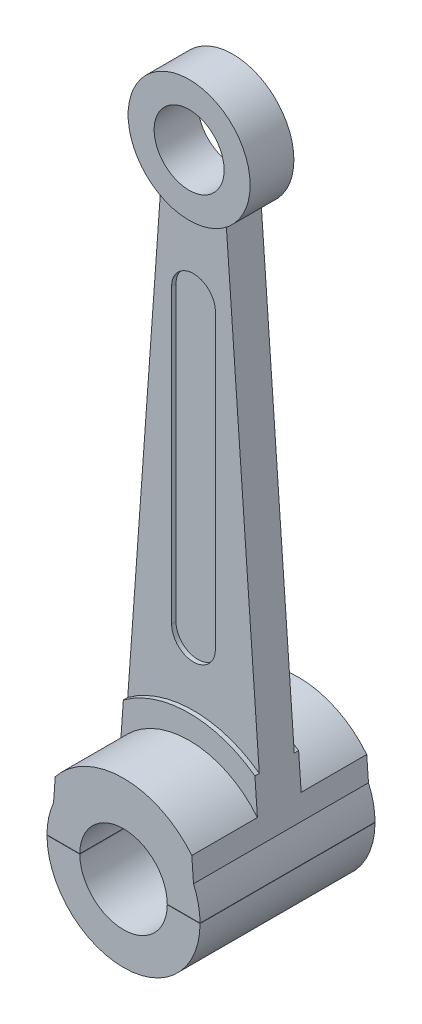
ISO-10303-21;
HEADER;
FILE_DESCRIPTION(('STEP AP214'),'2;1');
FILE_NAME('part.step','',(''),(''),'','','');
FILE_SCHEMA(('AUTOMOTIVE_DESIGN { 1 0 10303 214 1 1 1 1 }'));
ENDSEC;
DATA;
#1=APPLICATION_CONTEXT('core data for automotive mechanical design processes');
#2=APPLICATION_PROTOCOL_DEFINITION('international standard','automotive_design',2000,#1);
#3=PRODUCT_CONTEXT('',#1,'mechanical');
#4=PRODUCT('Part','Part','',(#3));
#5=PRODUCT_RELATED_PRODUCT_CATEGORY('part','',(#4));
#6=PRODUCT_DEFINITION_FORMATION('','',#4);
#7=PRODUCT_DEFINITION_CONTEXT('part definition',#1,'design');
#8=PRODUCT_DEFINITION('design','',#6,#7);
#9=PRODUCT_DEFINITION_SHAPE('','',#8);
#10=(LENGTH_UNIT() NAMED_UNIT(*) SI_UNIT(.MILLI.,.METRE.));
#11=(NAMED_UNIT(*) PLANE_ANGLE_UNIT() SI_UNIT($,.RADIAN.));
#12=(NAMED_UNIT(*) SI_UNIT($,.STERADIAN.) SOLID_ANGLE_UNIT());
#13=UNCERTAINTY_MEASURE_WITH_UNIT(LENGTH_MEASURE(1.E-05),#10,'distance_accuracy_value','');
#14=(GEOMETRIC_REPRESENTATION_CONTEXT(3) GLOBAL_UNCERTAINTY_ASSIGNED_CONTEXT((#13)) GLOBAL_UNIT_ASSIGNED_CONTEXT((#10,
#11,#12)) REPRESENTATION_CONTEXT('',''));
#15=CARTESIAN_POINT('',(0.,0.,0.));
#16=DIRECTION('',(0.,0.,1.));
#17=DIRECTION('',(1.,0.,0.));
#18=AXIS2_PLACEMENT_3D('',#15,#16,#17);
#19=CARTESIAN_POINT('',(0.,0.,-50.8));
#20=DIRECTION('',(0.,0.,1.));
#21=DIRECTION('',(1.,0.,0.));
#22=AXIS2_PLACEMENT_3D('',#19,#20,#21);
#23=PLANE('',#22);
#24=CARTESIAN_POINT('',(0.,0.,-50.8));
#25=DIRECTION('',(0.,0.,1.));
#26=DIRECTION('',(1.,0.,0.));
#27=AXIS2_PLACEMENT_3D('',#24,#25,#26);
#28=CIRCLE('',#27,44.45);
#29=CARTESIAN_POINT('',(40.64,18.0053575360224,-50.8));
#30=VERTEX_POINT('',#29);
#31=CARTESIAN_POINT('',(44.4498838855626,0.101599999999998,-50.8));
#32=VERTEX_POINT('',#31);
#33=EDGE_CURVE('E58',#30,#32,#28,.F.);
#34=ORIENTED_EDGE('',*,*,#33,.T.);
#35=DIRECTION('',(-1.,0.,0.));
#36=VECTOR('',#35,1.);
#37=CARTESIAN_POINT('',(0.,0.10159999999999,-50.8));
#38=LINE('',#37,#36);
#39=CARTESIAN_POINT('',(25.3997967991872,0.101599999999994,-50.8));
#40=VERTEX_POINT('',#39);
#41=EDGE_CURVE('E328',#32,#40,#38,.T.);
#42=ORIENTED_EDGE('',*,*,#41,.T.);
#43=CARTESIAN_POINT('',(0.,0.,-50.8));
#44=DIRECTION('',(0.,0.,1.));
#45=DIRECTION('',(1.,0.,0.));
#46=AXIS2_PLACEMENT_3D('',#43,#44,#45);
#47=CIRCLE('',#46,25.4);
#48=CARTESIAN_POINT('',(-25.3997967991872,0.101599999999985,-50.8));
#49=VERTEX_POINT('',#48);
#50=EDGE_CURVE('E332',#40,#49,#47,.T.);
#51=ORIENTED_EDGE('',*,*,#50,.T.);
#52=CARTESIAN_POINT('',(-44.4498838855626,0.101599999999982,-50.8));
#53=VERTEX_POINT('',#52);
#54=EDGE_CURVE('E75',#49,#53,#38,.T.);
#55=ORIENTED_EDGE('',*,*,#54,.T.);
#56=CARTESIAN_POINT('',(-40.64,18.0053575360224,-50.8));
#57=VERTEX_POINT('',#56);
#58=EDGE_CURVE('E307',#53,#57,#28,.F.);
#59=ORIENTED_EDGE('',*,*,#58,.T.);
#60=DIRECTION('',(0.0718181006562887,0.997417746191697,0.));
#61=VECTOR('',#60,1.);
#62=CARTESIAN_POINT('',(-41.7201568395476,3.00401956425881,-50.8));
#63=LINE('',#62,#61);
#64=CARTESIAN_POINT('',(-39.6497960989701,31.7574191223106,-50.8));
#65=VERTEX_POINT('',#64);
#66=EDGE_CURVE('E281',#57,#65,#63,.T.);
#67=ORIENTED_EDGE('',*,*,#66,.T.);
#68=CARTESIAN_POINT('',(0.,0.,-50.8));
#69=DIRECTION('',(0.,0.,1.));
#70=DIRECTION('',(1.,0.,0.));
#71=AXIS2_PLACEMENT_3D('',#68,#69,#70);
#72=CIRCLE('',#71,50.8);
#73=CARTESIAN_POINT('',(39.6497960989701,31.7574191223106,-50.8));
#74=VERTEX_POINT('',#73);
#75=EDGE_CURVE('E237',#74,#65,#72,.T.);
#76=ORIENTED_EDGE('',*,*,#75,.F.);
#77=DIRECTION('',(0.0718181006562886,-0.997417746191697,0.));
#78=VECTOR('',#77,1.);
#79=CARTESIAN_POINT('',(41.7201568395476,3.0040195642588,-50.8));
#80=LINE('',#79,#78);
#81=EDGE_CURVE('E277',#74,#30,#80,.T.);
#82=ORIENTED_EDGE('',*,*,#81,.T.);
#83=EDGE_LOOP('',(#34,#42,#51,#55,#59,#67,#76,#82));
#84=FACE_BOUND('',#83,.T.);
#85=ADVANCED_FACE('F55',(#84),#23,.F.);
#86=CARTESIAN_POINT('',(0.,0.,12.7));
#87=DIRECTION('',(0.,0.,-1.));
#88=DIRECTION('',(-1.,0.,0.));
#89=AXIS2_PLACEMENT_3D('',#86,#87,#88);
#90=CYLINDRICAL_SURFACE('',#89,25.4);
#91=DIRECTION('',(0.,0.,-1.));
#92=VECTOR('',#91,1.);
#93=CARTESIAN_POINT('',(25.3997967991872,0.101599999999994,12.7));
#94=LINE('',#93,#92);
#95=CARTESIAN_POINT('',(25.3997967991872,0.101599999999994,50.8));
#96=VERTEX_POINT('',#95);
#97=EDGE_CURVE('E327',#96,#40,#94,.T.);
#98=ORIENTED_EDGE('',*,*,#97,.F.);
#99=CARTESIAN_POINT('',(0.,0.,50.8));
#100=DIRECTION('',(0.,0.,1.));
#101=DIRECTION('',(1.,0.,0.));
#102=AXIS2_PLACEMENT_3D('',#99,#100,#101);
#103=CIRCLE('',#102,25.4);
#104=CARTESIAN_POINT('',(-25.3997967991872,0.101599999999985,50.8));
#105=VERTEX_POINT('',#104);
#106=EDGE_CURVE('E261',#96,#105,#103,.T.);
#107=ORIENTED_EDGE('',*,*,#106,.T.);
#108=DIRECTION('',(0.,0.,-1.));
#109=VECTOR('',#108,1.);
#110=CARTESIAN_POINT('',(-25.3997967991872,0.101599999999985,12.7));
#111=LINE('',#110,#109);
#112=EDGE_CURVE('E65',#49,#105,#111,.F.);
#113=ORIENTED_EDGE('',*,*,#112,.F.);
#114=ORIENTED_EDGE('',*,*,#50,.F.);
#115=EDGE_LOOP('',(#98,#107,#113,#114));
#116=FACE_BOUND('',#115,.T.);
#117=ADVANCED_FACE('F345',(#116),#90,.F.);
#118=CARTESIAN_POINT('',(0.,0.,50.8));
#119=DIRECTION('',(0.,0.,1.));
#120=DIRECTION('',(1.,0.,0.));
#121=AXIS2_PLACEMENT_3D('',#118,#119,#120);
#122=PLANE('',#121);
#123=DIRECTION('',(-1.,0.,0.));
#124=VECTOR('',#123,1.);
#125=CARTESIAN_POINT('',(0.,0.10159999999999,50.8));
#126=LINE('',#125,#124);
#127=CARTESIAN_POINT('',(44.4498838855626,0.101599999999998,50.8));
#128=VERTEX_POINT('',#127);
#129=EDGE_CURVE('E67',#128,#96,#126,.T.);
#130=ORIENTED_EDGE('',*,*,#129,.F.);
#131=CARTESIAN_POINT('',(0.,0.,50.8));
#132=DIRECTION('',(0.,0.,1.));
#133=DIRECTION('',(1.,0.,0.));
#134=AXIS2_PLACEMENT_3D('',#131,#132,#133);
#135=CIRCLE('',#134,44.45);
#136=CARTESIAN_POINT('',(40.64,18.0053575360224,50.8));
#137=VERTEX_POINT('',#136);
#138=EDGE_CURVE('E260',#137,#128,#135,.F.);
#139=ORIENTED_EDGE('',*,*,#138,.F.);
#140=DIRECTION('',(0.0718181006562886,-0.997417746191697,0.));
#141=VECTOR('',#140,1.);
#142=CARTESIAN_POINT('',(41.7201568395476,3.0040195642588,50.8));
#143=LINE('',#142,#141);
#144=CARTESIAN_POINT('',(39.6497960989701,31.7574191223106,50.8));
#145=VERTEX_POINT('',#144);
#146=EDGE_CURVE('E276',#145,#137,#143,.T.);
#147=ORIENTED_EDGE('',*,*,#146,.F.);
#148=CARTESIAN_POINT('',(0.,0.,50.8));
#149=DIRECTION('',(0.,0.,1.));
#150=DIRECTION('',(1.,0.,0.));
#151=AXIS2_PLACEMENT_3D('',#148,#149,#150);
#152=CIRCLE('',#151,50.8);
#153=CARTESIAN_POINT('',(-39.6497960989701,31.7574191223106,50.8));
#154=VERTEX_POINT('',#153);
#155=EDGE_CURVE('E256',#145,#154,#152,.T.);
#156=ORIENTED_EDGE('',*,*,#155,.T.);
#157=DIRECTION('',(0.0718181006562887,0.997417746191697,0.));
#158=VECTOR('',#157,1.);
#159=CARTESIAN_POINT('',(-41.7201568395476,3.00401956425881,50.8));
#160=LINE('',#159,#158);
#161=CARTESIAN_POINT('',(-40.64,18.0053575360224,50.8));
#162=VERTEX_POINT('',#161);
#163=EDGE_CURVE('E316',#162,#154,#160,.T.);
#164=ORIENTED_EDGE('',*,*,#163,.F.);
#165=CARTESIAN_POINT('',(-44.4498838855626,0.101599999999982,50.8));
#166=VERTEX_POINT('',#165);
#167=EDGE_CURVE('E289',#166,#162,#135,.F.);
#168=ORIENTED_EDGE('',*,*,#167,.F.);
#169=EDGE_CURVE('E12',#105,#166,#126,.T.);
#170=ORIENTED_EDGE('',*,*,#169,.F.);
#171=ORIENTED_EDGE('',*,*,#106,.F.);
#172=EDGE_LOOP('',(#130,#139,#147,#156,#164,#168,#170,#171));
#173=FACE_BOUND('',#172,.T.);
#174=ADVANCED_FACE('F349',(#173),#122,.T.);
#175=CARTESIAN_POINT('',(0.,0.,-81.2799999999999));
#176=DIRECTION('',(0.,0.,1.));
#177=DIRECTION('',(1.,0.,0.));
#178=AXIS2_PLACEMENT_3D('',#175,#176,#177);
#179=CYLINDRICAL_SURFACE('',#178,44.45);
#180=ORIENTED_EDGE('',*,*,#138,.T.);
#181=DIRECTION('',(0.,0.,1.));
#182=VECTOR('',#181,1.);
#183=CARTESIAN_POINT('',(44.4498838855626,0.101599999999998,-81.2799999999999));
#184=LINE('',#183,#182);
#185=EDGE_CURVE('E97',#128,#32,#184,.F.);
#186=ORIENTED_EDGE('',*,*,#185,.T.);
#187=ORIENTED_EDGE('',*,*,#33,.F.);
#188=DIRECTION('',(0.,0.,1.));
#189=VECTOR('',#188,1.);
#190=CARTESIAN_POINT('',(40.64,18.0053575360224,-81.2799999999999));
#191=LINE('',#190,#189);
#192=EDGE_CURVE('E320',#30,#137,#191,.T.);
#193=ORIENTED_EDGE('',*,*,#192,.T.);
#194=EDGE_LOOP('',(#180,#186,#187,#193));
#195=FACE_BOUND('',#194,.T.);
#196=ADVANCED_FACE('F518',(#195),#179,.T.);
#197=ORIENTED_EDGE('',*,*,#58,.F.);
#198=DIRECTION('',(0.,0.,1.));
#199=VECTOR('',#198,1.);
#200=CARTESIAN_POINT('',(-44.4498838855626,0.101599999999982,-81.2799999999999));
#201=LINE('',#200,#199);
#202=EDGE_CURVE('E324',#53,#166,#201,.T.);
#203=ORIENTED_EDGE('',*,*,#202,.T.);
#204=ORIENTED_EDGE('',*,*,#167,.T.);
#205=DIRECTION('',(0.,0.,1.));
#206=VECTOR('',#205,1.);
#207=CARTESIAN_POINT('',(-40.64,18.0053575360224,-81.2799999999999));
#208=LINE('',#207,#206);
#209=EDGE_CURVE('E304',#57,#162,#208,.T.);
#210=ORIENTED_EDGE('',*,*,#209,.F.);
#211=EDGE_LOOP('',(#197,#203,#204,#210));
#212=FACE_BOUND('',#211,.T.);
#213=ADVANCED_FACE('F359',(#212),#179,.T.);
#214=CARTESIAN_POINT('',(0.,0.,12.7));
#215=DIRECTION('',(0.,0.,-1.));
#216=DIRECTION('',(-1.,0.,0.));
#217=AXIS2_PLACEMENT_3D('',#214,#215,#216);
#218=CYLINDRICAL_SURFACE('',#217,64.516);
#219=CARTESIAN_POINT('',(0.,0.,12.7));
#220=DIRECTION('',(0.,0.,1.));
#221=DIRECTION('',(1.,0.,0.));
#222=AXIS2_PLACEMENT_3D('',#219,#220,#221);
#223=CIRCLE('',#222,64.516);
#224=CARTESIAN_POINT('',(38.1924925018651,51.9966130867673,12.7));
#225=VERTEX_POINT('',#224);
#226=CARTESIAN_POINT('',(-38.1924925018651,51.9966130867673,12.7));
#227=VERTEX_POINT('',#226);
#228=EDGE_CURVE('E207',#225,#227,#223,.T.);
#229=ORIENTED_EDGE('',*,*,#228,.F.);
#230=DIRECTION('',(0.,0.,-1.));
#231=VECTOR('',#230,1.);
#232=CARTESIAN_POINT('',(38.1924925018651,51.9966130867673,12.7));
#233=LINE('',#232,#231);
#234=CARTESIAN_POINT('',(38.1924925018651,51.9966130867673,10.16));
#235=VERTEX_POINT('',#234);
#236=EDGE_CURVE('E285',#225,#235,#233,.T.);
#237=ORIENTED_EDGE('',*,*,#236,.T.);
#238=CARTESIAN_POINT('',(0.,0.,10.16));
#239=DIRECTION('',(0.,0.,1.));
#240=DIRECTION('',(1.,0.,0.));
#241=AXIS2_PLACEMENT_3D('',#238,#239,#240);
#242=CIRCLE('',#241,64.516);
#243=CARTESIAN_POINT('',(-38.1924925018651,51.9966130867673,10.16));
#244=VERTEX_POINT('',#243);
#245=EDGE_CURVE('E177',#235,#244,#242,.T.);
#246=ORIENTED_EDGE('',*,*,#245,.T.);
#247=DIRECTION('',(0.,0.,-1.));
#248=VECTOR('',#247,1.);
#249=CARTESIAN_POINT('',(-38.1924925018651,51.9966130867673,12.7));
#250=LINE('',#249,#248);
#251=EDGE_CURVE('E139',#244,#227,#250,.F.);
#252=ORIENTED_EDGE('',*,*,#251,.T.);
#253=EDGE_LOOP('',(#229,#237,#246,#252));
#254=FACE_BOUND('',#253,.T.);
#255=ADVANCED_FACE('F532',(#254),#218,.T.);
#256=CARTESIAN_POINT('',(0.,101.6,10.16));
#257=DIRECTION('',(0.,0.,-1.));
#258=DIRECTION('',(-1.,0.,0.));
#259=AXIS2_PLACEMENT_3D('',#256,#257,#258);
#260=CYLINDRICAL_SURFACE('',#259,12.7);
#261=DIRECTION('',(0.,0.,-1.));
#262=VECTOR('',#261,1.);
#263=CARTESIAN_POINT('',(-12.7,101.6,10.16));
#264=LINE('',#263,#262);
#265=CARTESIAN_POINT('',(-12.7,101.6,-7.62));
#266=VERTEX_POINT('',#265);
#267=CARTESIAN_POINT('',(-12.7,101.6,-10.16));
#268=VERTEX_POINT('',#267);
#269=EDGE_CURVE('E217',#266,#268,#264,.T.);
#270=ORIENTED_EDGE('',*,*,#269,.F.);
#271=CARTESIAN_POINT('',(0.,101.6,-7.62));
#272=DIRECTION('',(0.,0.,1.));
#273=DIRECTION('',(1.,0.,0.));
#274=AXIS2_PLACEMENT_3D('',#271,#272,#273);
#275=CIRCLE('',#274,12.7);
#276=CARTESIAN_POINT('',(12.7,101.6,-7.62));
#277=VERTEX_POINT('',#276);
#278=EDGE_CURVE('E224',#266,#277,#275,.T.);
#279=ORIENTED_EDGE('',*,*,#278,.T.);
#280=DIRECTION('',(0.,0.,-1.));
#281=VECTOR('',#280,1.);
#282=CARTESIAN_POINT('',(12.7,101.6,10.16));
#283=LINE('',#282,#281);
#284=CARTESIAN_POINT('',(12.7,101.6,-10.16));
#285=VERTEX_POINT('',#284);
#286=EDGE_CURVE('E228',#277,#285,#283,.T.);
#287=ORIENTED_EDGE('',*,*,#286,.T.);
#288=CARTESIAN_POINT('',(0.,101.6,-10.16));
#289=DIRECTION('',(0.,0.,1.));
#290=DIRECTION('',(1.,0.,0.));
#291=AXIS2_PLACEMENT_3D('',#288,#289,#290);
#292=CIRCLE('',#291,12.7);
#293=EDGE_CURVE('E183',#268,#285,#292,.T.);
#294=ORIENTED_EDGE('',*,*,#293,.F.);
#295=EDGE_LOOP('',(#270,#279,#287,#294));
#296=FACE_BOUND('',#295,.T.);
#297=ADVANCED_FACE('F432',(#296),#260,.F.);
#298=CARTESIAN_POINT('',(-12.7,0.,10.16));
#299=DIRECTION('',(1.,0.,0.));
#300=DIRECTION('',(0.,1.,0.));
#301=AXIS2_PLACEMENT_3D('',#298,#299,#300);
#302=PLANE('',#301);
#303=DIRECTION('',(0.,0.,-1.));
#304=VECTOR('',#303,1.);
#305=CARTESIAN_POINT('',(-12.7,271.526,10.16));
#306=LINE('',#305,#304);
#307=CARTESIAN_POINT('',(-12.7,271.526,-7.62));
#308=VERTEX_POINT('',#307);
#309=CARTESIAN_POINT('',(-12.7,271.526,-10.16));
#310=VERTEX_POINT('',#309);
#311=EDGE_CURVE('E216',#308,#310,#306,.T.);
#312=ORIENTED_EDGE('',*,*,#311,.F.);
#313=DIRECTION('',(0.,-1.,0.));
#314=VECTOR('',#313,1.);
#315=CARTESIAN_POINT('',(-12.7,0.,-7.62));
#316=LINE('',#315,#314);
#317=EDGE_CURVE('E229',#308,#266,#316,.T.);
#318=ORIENTED_EDGE('',*,*,#317,.T.);
#319=ORIENTED_EDGE('',*,*,#269,.T.);
#320=DIRECTION('',(0.,-1.,0.));
#321=VECTOR('',#320,1.);
#322=CARTESIAN_POINT('',(-12.7,0.,-10.16));
#323=LINE('',#322,#321);
#324=EDGE_CURVE('E405',#310,#268,#323,.T.);
#325=ORIENTED_EDGE('',*,*,#324,.F.);
#326=EDGE_LOOP('',(#312,#318,#319,#325));
#327=FACE_BOUND('',#326,.T.);
#328=ADVANCED_FACE('F553',(#327),#302,.T.);
#329=CARTESIAN_POINT('',(0.,271.526,10.16));
#330=DIRECTION('',(0.,0.,-1.));
#331=DIRECTION('',(-1.,0.,0.));
#332=AXIS2_PLACEMENT_3D('',#329,#330,#331);
#333=CYLINDRICAL_SURFACE('',#332,12.7);
#334=DIRECTION('',(0.,0.,-1.));
#335=VECTOR('',#334,1.);
#336=CARTESIAN_POINT('',(12.7,271.526,10.16));
#337=LINE('',#336,#335);
#338=CARTESIAN_POINT('',(12.7,271.526,-7.62));
#339=VERTEX_POINT('',#338);
#340=CARTESIAN_POINT('',(12.7,271.526,-10.16));
#341=VERTEX_POINT('',#340);
#342=EDGE_CURVE('E396',#339,#341,#337,.T.);
#343=ORIENTED_EDGE('',*,*,#342,.F.);
#344=CARTESIAN_POINT('',(0.,271.526,-7.62));
#345=DIRECTION('',(0.,0.,1.));
#346=DIRECTION('',(1.,0.,0.));
#347=AXIS2_PLACEMENT_3D('',#344,#345,#346);
#348=CIRCLE('',#347,12.7);
#349=EDGE_CURVE('E212',#339,#308,#348,.T.);
#350=ORIENTED_EDGE('',*,*,#349,.T.);
#351=ORIENTED_EDGE('',*,*,#311,.T.);
#352=CARTESIAN_POINT('',(0.,271.526,-10.16));
#353=DIRECTION('',(0.,0.,1.));
#354=DIRECTION('',(1.,0.,0.));
#355=AXIS2_PLACEMENT_3D('',#352,#353,#354);
#356=CIRCLE('',#355,12.7);
#357=EDGE_CURVE('E409',#341,#310,#356,.T.);
#358=ORIENTED_EDGE('',*,*,#357,.F.);
#359=EDGE_LOOP('',(#343,#350,#351,#358));
#360=FACE_BOUND('',#359,.T.);
#361=ADVANCED_FACE('F547',(#360),#333,.F.);
#362=CARTESIAN_POINT('',(12.7,0.,10.16));
#363=DIRECTION('',(1.,0.,0.));
#364=DIRECTION('',(0.,1.,0.));
#365=AXIS2_PLACEMENT_3D('',#362,#363,#364);
#366=PLANE('',#365);
#367=DIRECTION('',(0.,-1.,0.));
#368=VECTOR('',#367,1.);
#369=CARTESIAN_POINT('',(12.7,0.,-7.62));
#370=LINE('',#369,#368);
#371=EDGE_CURVE('E218',#339,#277,#370,.T.);
#372=ORIENTED_EDGE('',*,*,#371,.F.);
#373=ORIENTED_EDGE('',*,*,#342,.T.);
#374=DIRECTION('',(0.,-1.,0.));
#375=VECTOR('',#374,1.);
#376=CARTESIAN_POINT('',(12.7,0.,-10.16));
#377=LINE('',#376,#375);
#378=EDGE_CURVE('E173',#341,#285,#377,.T.);
#379=ORIENTED_EDGE('',*,*,#378,.T.);
#380=ORIENTED_EDGE('',*,*,#286,.F.);
#381=EDGE_LOOP('',(#372,#373,#379,#380));
#382=FACE_BOUND('',#381,.T.);
#383=ADVANCED_FACE('F543',(#382),#366,.F.);
#384=CARTESIAN_POINT('',(0.,347.726,12.7));
#385=DIRECTION('',(0.,0.,-1.));
#386=DIRECTION('',(-1.,0.,0.));
#387=AXIS2_PLACEMENT_3D('',#384,#385,#386);
#388=CYLINDRICAL_SURFACE('',#387,20.32);
#389=CARTESIAN_POINT('',(0.,347.726,12.7));
#390=DIRECTION('',(0.,0.,1.));
#391=DIRECTION('',(1.,0.,0.));
#392=AXIS2_PLACEMENT_3D('',#389,#390,#391);
#393=CIRCLE('',#392,20.32);
#394=CARTESIAN_POINT('',(20.32,347.726,12.7));
#395=VERTEX_POINT('',#394);
#396=EDGE_CURVE('E166',#395,#395,#393,.T.);
#397=ORIENTED_EDGE('',*,*,#396,.T.);
#398=EDGE_LOOP('',(#397));
#399=FACE_BOUND('',#398,.T.);
#400=CARTESIAN_POINT('',(0.,347.726,-12.7));
#401=DIRECTION('',(0.,0.,1.));
#402=DIRECTION('',(1.,0.,0.));
#403=AXIS2_PLACEMENT_3D('',#400,#401,#402);
#404=CIRCLE('',#403,20.32);
#405=CARTESIAN_POINT('',(20.32,347.726,-12.7));
#406=VERTEX_POINT('',#405);
#407=EDGE_CURVE('E200',#406,#406,#404,.T.);
#408=ORIENTED_EDGE('',*,*,#407,.F.);
#409=EDGE_LOOP('',(#408));
#410=FACE_BOUND('',#409,.T.);
#411=ADVANCED_FACE('F635',(#399,#410),#388,.F.);
#412=CARTESIAN_POINT('',(0.,347.726,12.7));
#413=DIRECTION('',(0.,0.,-1.));
#414=DIRECTION('',(-1.,0.,0.));
#415=AXIS2_PLACEMENT_3D('',#412,#413,#414);
#416=CYLINDRICAL_SURFACE('',#415,35.433);
#417=CARTESIAN_POINT('',(0.,347.726,10.16));
#418=DIRECTION('',(0.,0.,1.));
#419=DIRECTION('',(1.,0.,0.));
#420=AXIS2_PLACEMENT_3D('',#417,#418,#419);
#421=CIRCLE('',#420,35.433);
#422=CARTESIAN_POINT('',(-19.05,317.849671761744,10.16));
#423=VERTEX_POINT('',#422);
#424=CARTESIAN_POINT('',(19.05,317.849671761744,10.16));
#425=VERTEX_POINT('',#424);
#426=EDGE_CURVE('E154',#423,#425,#421,.T.);
#427=ORIENTED_EDGE('',*,*,#426,.T.);
#428=DIRECTION('',(0.,0.,-1.));
#429=VECTOR('',#428,1.);
#430=CARTESIAN_POINT('',(19.05,317.849671761744,10.16));
#431=LINE('',#430,#429);
#432=CARTESIAN_POINT('',(19.05,317.849671761744,-10.16));
#433=VERTEX_POINT('',#432);
#434=EDGE_CURVE('E165',#425,#433,#431,.T.);
#435=ORIENTED_EDGE('',*,*,#434,.T.);
#436=CARTESIAN_POINT('',(0.,347.726,-10.16));
#437=DIRECTION('',(0.,0.,1.));
#438=DIRECTION('',(1.,0.,0.));
#439=AXIS2_PLACEMENT_3D('',#436,#437,#438);
#440=CIRCLE('',#439,35.433);
#441=CARTESIAN_POINT('',(-19.05,317.849671761744,-10.16));
#442=VERTEX_POINT('',#441);
#443=EDGE_CURVE('E156',#442,#433,#440,.T.);
#444=ORIENTED_EDGE('',*,*,#443,.F.);
#445=DIRECTION('',(0.,0.,-1.));
#446=VECTOR('',#445,1.);
#447=CARTESIAN_POINT('',(-19.05,317.849671761744,10.16));
#448=LINE('',#447,#446);
#449=EDGE_CURVE('E137',#423,#442,#448,.T.);
#450=ORIENTED_EDGE('',*,*,#449,.F.);
#451=EDGE_LOOP('',(#427,#435,#444,#450));
#452=FACE_BOUND('',#451,.T.);
#453=CARTESIAN_POINT('',(0.,347.726,-12.7));
#454=DIRECTION('',(0.,0.,1.));
#455=DIRECTION('',(1.,0.,0.));
#456=AXIS2_PLACEMENT_3D('',#453,#454,#455);
#457=CIRCLE('',#456,35.433);
#458=CARTESIAN_POINT('',(35.433,347.726,-12.7));
#459=VERTEX_POINT('',#458);
#460=EDGE_CURVE('E170',#459,#459,#457,.T.);
#461=ORIENTED_EDGE('',*,*,#460,.T.);
#462=EDGE_LOOP('',(#461));
#463=FACE_BOUND('',#462,.T.);
#464=CARTESIAN_POINT('',(0.,347.726,12.7));
#465=DIRECTION('',(0.,0.,1.));
#466=DIRECTION('',(1.,0.,0.));
#467=AXIS2_PLACEMENT_3D('',#464,#465,#466);
#468=CIRCLE('',#467,35.433);
#469=CARTESIAN_POINT('',(35.433,347.726,12.7));
#470=VERTEX_POINT('',#469);
#471=EDGE_CURVE('E380',#470,#470,#468,.T.);
#472=ORIENTED_EDGE('',*,*,#471,.F.);
#473=EDGE_LOOP('',(#472));
#474=FACE_BOUND('',#473,.T.);
#475=ADVANCED_FACE('F150',(#452,#463,#474),#416,.T.);
#476=CARTESIAN_POINT('',(0.,0.,12.7));
#477=DIRECTION('',(0.,0.,1.));
#478=DIRECTION('',(1.,0.,0.));
#479=AXIS2_PLACEMENT_3D('',#476,#477,#478);
#480=PLANE('',#479);
#481=ORIENTED_EDGE('',*,*,#396,.F.);
#482=EDGE_LOOP('',(#481));
#483=FACE_BOUND('',#482,.T.);
#484=ORIENTED_EDGE('',*,*,#471,.T.);
#485=EDGE_LOOP('',(#484));
#486=FACE_BOUND('',#485,.T.);
#487=ADVANCED_FACE('F626',(#483,#486),#480,.T.);
#488=CARTESIAN_POINT('',(0.,0.,-12.7));
#489=DIRECTION('',(0.,0.,1.));
#490=DIRECTION('',(1.,0.,0.));
#491=AXIS2_PLACEMENT_3D('',#488,#489,#490);
#492=PLANE('',#491);
#493=ORIENTED_EDGE('',*,*,#407,.T.);
#494=EDGE_LOOP('',(#493));
#495=FACE_BOUND('',#494,.T.);
#496=ORIENTED_EDGE('',*,*,#460,.F.);
#497=EDGE_LOOP('',(#496));
#498=FACE_BOUND('',#497,.T.);
#499=ADVANCED_FACE('F622',(#495,#498),#492,.F.);
#500=CARTESIAN_POINT('',(0.,101.6,7.62));
#501=DIRECTION('',(0.,0.,1.));
#502=DIRECTION('',(1.,0.,0.));
#503=AXIS2_PLACEMENT_3D('',#500,#501,#502);
#504=CIRCLE('',#503,12.7);
#505=CARTESIAN_POINT('',(-12.7,101.6,7.62));
#506=VERTEX_POINT('',#505);
#507=CARTESIAN_POINT('',(12.7,101.6,7.62));
#508=VERTEX_POINT('',#507);
#509=EDGE_CURVE('E238',#506,#508,#504,.T.);
#510=ORIENTED_EDGE('',*,*,#509,.F.);
#511=CARTESIAN_POINT('',(-12.7,101.6,10.16));
#512=VERTEX_POINT('',#511);
#513=EDGE_CURVE('E190',#512,#506,#264,.T.);
#514=ORIENTED_EDGE('',*,*,#513,.F.);
#515=CARTESIAN_POINT('',(0.,101.6,10.16));
#516=DIRECTION('',(0.,0.,1.));
#517=DIRECTION('',(1.,0.,0.));
#518=AXIS2_PLACEMENT_3D('',#515,#516,#517);
#519=CIRCLE('',#518,12.7);
#520=CARTESIAN_POINT('',(12.7,101.6,10.16));
#521=VERTEX_POINT('',#520);
#522=EDGE_CURVE('E196',#512,#521,#519,.T.);
#523=ORIENTED_EDGE('',*,*,#522,.T.);
#524=EDGE_CURVE('E195',#521,#508,#283,.T.);
#525=ORIENTED_EDGE('',*,*,#524,.T.);
#526=EDGE_LOOP('',(#510,#514,#523,#525));
#527=FACE_BOUND('',#526,.T.);
#528=ADVANCED_FACE('F564',(#527),#260,.F.);
#529=DIRECTION('',(0.,-1.,0.));
#530=VECTOR('',#529,1.);
#531=CARTESIAN_POINT('',(-12.7,0.,7.62));
#532=LINE('',#531,#530);
#533=CARTESIAN_POINT('',(-12.7,271.526,7.62));
#534=VERTEX_POINT('',#533);
#535=EDGE_CURVE('E222',#534,#506,#532,.T.);
#536=ORIENTED_EDGE('',*,*,#535,.F.);
#537=CARTESIAN_POINT('',(-12.7,271.526,10.16));
#538=VERTEX_POINT('',#537);
#539=EDGE_CURVE('E189',#538,#534,#306,.T.);
#540=ORIENTED_EDGE('',*,*,#539,.F.);
#541=DIRECTION('',(0.,-1.,0.));
#542=VECTOR('',#541,1.);
#543=CARTESIAN_POINT('',(-12.7,0.,10.16));
#544=LINE('',#543,#542);
#545=EDGE_CURVE('E191',#538,#512,#544,.T.);
#546=ORIENTED_EDGE('',*,*,#545,.T.);
#547=ORIENTED_EDGE('',*,*,#513,.T.);
#548=EDGE_LOOP('',(#536,#540,#546,#547));
#549=FACE_BOUND('',#548,.T.);
#550=ADVANCED_FACE('F556',(#549),#302,.T.);
#551=CARTESIAN_POINT('',(0.,271.526,7.62));
#552=DIRECTION('',(0.,0.,1.));
#553=DIRECTION('',(1.,0.,0.));
#554=AXIS2_PLACEMENT_3D('',#551,#552,#553);
#555=CIRCLE('',#554,12.7);
#556=CARTESIAN_POINT('',(12.7,271.526,7.62));
#557=VERTEX_POINT('',#556);
#558=EDGE_CURVE('E233',#557,#534,#555,.T.);
#559=ORIENTED_EDGE('',*,*,#558,.F.);
#560=CARTESIAN_POINT('',(12.7,271.526,10.16));
#561=VERTEX_POINT('',#560);
#562=EDGE_CURVE('E242',#561,#557,#337,.T.);
#563=ORIENTED_EDGE('',*,*,#562,.F.);
#564=CARTESIAN_POINT('',(0.,271.526,10.16));
#565=DIRECTION('',(0.,0.,1.));
#566=DIRECTION('',(1.,0.,0.));
#567=AXIS2_PLACEMENT_3D('',#564,#565,#566);
#568=CIRCLE('',#567,12.7);
#569=EDGE_CURVE('E185',#561,#538,#568,.T.);
#570=ORIENTED_EDGE('',*,*,#569,.T.);
#571=ORIENTED_EDGE('',*,*,#539,.T.);
#572=EDGE_LOOP('',(#559,#563,#570,#571));
#573=FACE_BOUND('',#572,.T.);
#574=ADVANCED_FACE('F562',(#573),#333,.F.);
#575=ORIENTED_EDGE('',*,*,#562,.T.);
#576=DIRECTION('',(0.,-1.,0.));
#577=VECTOR('',#576,1.);
#578=CARTESIAN_POINT('',(12.7,0.,7.62));
#579=LINE('',#578,#577);
#580=EDGE_CURVE('E184',#557,#508,#579,.T.);
#581=ORIENTED_EDGE('',*,*,#580,.T.);
#582=ORIENTED_EDGE('',*,*,#524,.F.);
#583=DIRECTION('',(0.,-1.,0.));
#584=VECTOR('',#583,1.);
#585=CARTESIAN_POINT('',(12.7,0.,10.16));
#586=LINE('',#585,#584);
#587=EDGE_CURVE('E179',#561,#521,#586,.T.);
#588=ORIENTED_EDGE('',*,*,#587,.F.);
#589=EDGE_LOOP('',(#575,#581,#582,#588));
#590=FACE_BOUND('',#589,.T.);
#591=ADVANCED_FACE('F601',(#590),#366,.F.);
#592=CARTESIAN_POINT('',(0.,0.,10.16));
#593=DIRECTION('',(0.,0.,1.));
#594=DIRECTION('',(1.,0.,0.));
#595=AXIS2_PLACEMENT_3D('',#592,#593,#594);
#596=PLANE('',#595);
#597=DIRECTION('',(0.0718181006562886,-0.997417746191697,0.));
#598=VECTOR('',#597,1.);
#599=CARTESIAN_POINT('',(41.7201568395476,3.0040195642588,10.16));
#600=LINE('',#599,#598);
#601=EDGE_CURVE('E163',#425,#235,#600,.T.);
#602=ORIENTED_EDGE('',*,*,#601,.F.);
#603=ORIENTED_EDGE('',*,*,#426,.F.);
#604=DIRECTION('',(0.0718181006562887,0.997417746191697,0.));
#605=VECTOR('',#604,1.);
#606=CARTESIAN_POINT('',(-41.7201568395476,3.00401956425881,10.16));
#607=LINE('',#606,#605);
#608=EDGE_CURVE('E134',#244,#423,#607,.T.);
#609=ORIENTED_EDGE('',*,*,#608,.F.);
#610=ORIENTED_EDGE('',*,*,#245,.F.);
#611=EDGE_LOOP('',(#602,#603,#609,#610));
#612=FACE_BOUND('',#611,.T.);
#613=ORIENTED_EDGE('',*,*,#522,.F.);
#614=ORIENTED_EDGE('',*,*,#545,.F.);
#615=ORIENTED_EDGE('',*,*,#569,.F.);
#616=ORIENTED_EDGE('',*,*,#587,.T.);
#617=EDGE_LOOP('',(#613,#614,#615,#616));
#618=FACE_BOUND('',#617,.T.);
#619=ADVANCED_FACE('F160',(#612,#618),#596,.T.);
#620=CARTESIAN_POINT('',(0.,0.,-10.16));
#621=DIRECTION('',(0.,0.,1.));
#622=DIRECTION('',(1.,0.,0.));
#623=AXIS2_PLACEMENT_3D('',#620,#621,#622);
#624=PLANE('',#623);
#625=ORIENTED_EDGE('',*,*,#293,.T.);
#626=ORIENTED_EDGE('',*,*,#378,.F.);
#627=ORIENTED_EDGE('',*,*,#357,.T.);
#628=ORIENTED_EDGE('',*,*,#324,.T.);
#629=EDGE_LOOP('',(#625,#626,#627,#628));
#630=FACE_BOUND('',#629,.T.);
#631=ORIENTED_EDGE('',*,*,#443,.T.);
#632=DIRECTION('',(0.0718181006562886,-0.997417746191697,0.));
#633=VECTOR('',#632,1.);
#634=CARTESIAN_POINT('',(41.7201568395476,3.0040195642588,-10.16));
#635=LINE('',#634,#633);
#636=CARTESIAN_POINT('',(38.1924925018651,51.9966130867673,-10.16));
#637=VERTEX_POINT('',#636);
#638=EDGE_CURVE('E262',#433,#637,#635,.T.);
#639=ORIENTED_EDGE('',*,*,#638,.T.);
#640=CARTESIAN_POINT('',(0.,0.,-10.16));
#641=DIRECTION('',(0.,0.,1.));
#642=DIRECTION('',(1.,0.,0.));
#643=AXIS2_PLACEMENT_3D('',#640,#641,#642);
#644=CIRCLE('',#643,64.516);
#645=CARTESIAN_POINT('',(-38.1924925018651,51.9966130867673,-10.16));
#646=VERTEX_POINT('',#645);
#647=EDGE_CURVE('E266',#637,#646,#644,.T.);
#648=ORIENTED_EDGE('',*,*,#647,.T.);
#649=DIRECTION('',(0.0718181006562887,0.997417746191697,0.));
#650=VECTOR('',#649,1.);
#651=CARTESIAN_POINT('',(-41.7201568395476,3.00401956425881,-10.16));
#652=LINE('',#651,#650);
#653=EDGE_CURVE('E105',#646,#442,#652,.T.);
#654=ORIENTED_EDGE('',*,*,#653,.T.);
#655=EDGE_LOOP('',(#631,#639,#648,#654));
#656=FACE_BOUND('',#655,.T.);
#657=ADVANCED_FACE('F421',(#630,#656),#624,.F.);
#658=ORIENTED_EDGE('',*,*,#647,.F.);
#659=CARTESIAN_POINT('',(38.1924925018651,51.9966130867673,-12.7));
#660=VERTEX_POINT('',#659);
#661=EDGE_CURVE('E206',#637,#660,#233,.T.);
#662=ORIENTED_EDGE('',*,*,#661,.T.);
#663=CARTESIAN_POINT('',(0.,0.,-12.7));
#664=DIRECTION('',(0.,0.,1.));
#665=DIRECTION('',(1.,0.,0.));
#666=AXIS2_PLACEMENT_3D('',#663,#664,#665);
#667=CIRCLE('',#666,64.516);
#668=CARTESIAN_POINT('',(-38.1924925018651,51.9966130867673,-12.7));
#669=VERTEX_POINT('',#668);
#670=EDGE_CURVE('E201',#660,#669,#667,.T.);
#671=ORIENTED_EDGE('',*,*,#670,.T.);
#672=EDGE_CURVE('E205',#669,#646,#250,.F.);
#673=ORIENTED_EDGE('',*,*,#672,.T.);
#674=EDGE_LOOP('',(#658,#662,#671,#673));
#675=FACE_BOUND('',#674,.T.);
#676=ADVANCED_FACE('F497',(#675),#218,.T.);
#677=CARTESIAN_POINT('',(0.,0.,12.7));
#678=DIRECTION('',(0.,0.,1.));
#679=DIRECTION('',(1.,0.,0.));
#680=AXIS2_PLACEMENT_3D('',#677,#678,#679);
#681=PLANE('',#680);
#682=DIRECTION('',(0.0718181006562886,-0.997417746191697,0.));
#683=VECTOR('',#682,1.);
#684=CARTESIAN_POINT('',(41.7201568395476,3.0040195642588,12.7));
#685=LINE('',#684,#683);
#686=CARTESIAN_POINT('',(39.64979609897,31.7574191223106,12.7));
#687=VERTEX_POINT('',#686);
#688=EDGE_CURVE('E284',#225,#687,#685,.T.);
#689=ORIENTED_EDGE('',*,*,#688,.F.);
#690=ORIENTED_EDGE('',*,*,#228,.T.);
#691=DIRECTION('',(0.0718181006562887,0.997417746191697,0.));
#692=VECTOR('',#691,1.);
#693=CARTESIAN_POINT('',(-41.7201568395476,3.00401956425881,12.7));
#694=LINE('',#693,#692);
#695=CARTESIAN_POINT('',(-39.64979609897,31.7574191223106,12.7));
#696=VERTEX_POINT('',#695);
#697=EDGE_CURVE('E145',#696,#227,#694,.T.);
#698=ORIENTED_EDGE('',*,*,#697,.F.);
#699=CARTESIAN_POINT('',(0.,0.,12.7));
#700=DIRECTION('',(0.,0.,1.));
#701=DIRECTION('',(1.,0.,0.));
#702=AXIS2_PLACEMENT_3D('',#699,#700,#701);
#703=CIRCLE('',#702,50.8);
#704=EDGE_CURVE('E249',#687,#696,#703,.T.);
#705=ORIENTED_EDGE('',*,*,#704,.F.);
#706=EDGE_LOOP('',(#689,#690,#698,#705));
#707=FACE_BOUND('',#706,.T.);
#708=ADVANCED_FACE('F529',(#707),#681,.T.);
#709=CARTESIAN_POINT('',(0.,0.,-12.7));
#710=DIRECTION('',(0.,0.,1.));
#711=DIRECTION('',(1.,0.,0.));
#712=AXIS2_PLACEMENT_3D('',#709,#710,#711);
#713=PLANE('',#712);
#714=ORIENTED_EDGE('',*,*,#670,.F.);
#715=DIRECTION('',(0.0718181006562886,-0.997417746191697,0.));
#716=VECTOR('',#715,1.);
#717=CARTESIAN_POINT('',(41.7201568395476,3.0040195642588,-12.7));
#718=LINE('',#717,#716);
#719=CARTESIAN_POINT('',(39.64979609897,31.7574191223106,-12.7));
#720=VERTEX_POINT('',#719);
#721=EDGE_CURVE('E211',#660,#720,#718,.T.);
#722=ORIENTED_EDGE('',*,*,#721,.T.);
#723=CARTESIAN_POINT('',(0.,0.,-12.7));
#724=DIRECTION('',(0.,0.,1.));
#725=DIRECTION('',(1.,0.,0.));
#726=AXIS2_PLACEMENT_3D('',#723,#724,#725);
#727=CIRCLE('',#726,50.8);
#728=CARTESIAN_POINT('',(-39.64979609897,31.7574191223106,-12.7));
#729=VERTEX_POINT('',#728);
#730=EDGE_CURVE('E270',#720,#729,#727,.T.);
#731=ORIENTED_EDGE('',*,*,#730,.T.);
#732=DIRECTION('',(0.0718181006562887,0.997417746191697,0.));
#733=VECTOR('',#732,1.);
#734=CARTESIAN_POINT('',(-41.7201568395476,3.00401956425881,-12.7));
#735=LINE('',#734,#733);
#736=EDGE_CURVE('E223',#729,#669,#735,.T.);
#737=ORIENTED_EDGE('',*,*,#736,.T.);
#738=EDGE_LOOP('',(#714,#722,#731,#737));
#739=FACE_BOUND('',#738,.T.);
#740=ADVANCED_FACE('F503',(#739),#713,.F.);
#741=CARTESIAN_POINT('',(0.,0.,-7.62));
#742=DIRECTION('',(0.,0.,1.));
#743=DIRECTION('',(1.,0.,0.));
#744=AXIS2_PLACEMENT_3D('',#741,#742,#743);
#745=PLANE('',#744);
#746=ORIENTED_EDGE('',*,*,#317,.F.);
#747=ORIENTED_EDGE('',*,*,#349,.F.);
#748=ORIENTED_EDGE('',*,*,#371,.T.);
#749=ORIENTED_EDGE('',*,*,#278,.F.);
#750=EDGE_LOOP('',(#746,#747,#748,#749));
#751=FACE_BOUND('',#750,.T.);
#752=ADVANCED_FACE('F552',(#751),#745,.F.);
#753=CARTESIAN_POINT('',(0.,0.,7.62));
#754=DIRECTION('',(0.,0.,1.));
#755=DIRECTION('',(1.,0.,0.));
#756=AXIS2_PLACEMENT_3D('',#753,#754,#755);
#757=PLANE('',#756);
#758=ORIENTED_EDGE('',*,*,#535,.T.);
#759=ORIENTED_EDGE('',*,*,#509,.T.);
#760=ORIENTED_EDGE('',*,*,#580,.F.);
#761=ORIENTED_EDGE('',*,*,#558,.T.);
#762=EDGE_LOOP('',(#758,#759,#760,#761));
#763=FACE_BOUND('',#762,.T.);
#764=ADVANCED_FACE('F587',(#763),#757,.T.);
#765=CARTESIAN_POINT('',(0.,0.,-50.8));
#766=DIRECTION('',(0.,0.,1.));
#767=DIRECTION('',(1.,0.,0.));
#768=AXIS2_PLACEMENT_3D('',#765,#766,#767);
#769=CYLINDRICAL_SURFACE('',#768,50.8);
#770=DIRECTION('',(0.,0.,1.));
#771=VECTOR('',#770,1.);
#772=CARTESIAN_POINT('',(39.64979609897,31.7574191223106,-50.8));
#773=LINE('',#772,#771);
#774=EDGE_CURVE('E271',#74,#720,#773,.T.);
#775=ORIENTED_EDGE('',*,*,#774,.F.);
#776=ORIENTED_EDGE('',*,*,#75,.T.);
#777=DIRECTION('',(0.,0.,1.));
#778=VECTOR('',#777,1.);
#779=CARTESIAN_POINT('',(-39.64979609897,31.7574191223106,-50.8));
#780=LINE('',#779,#778);
#781=EDGE_CURVE('E275',#729,#65,#780,.F.);
#782=ORIENTED_EDGE('',*,*,#781,.F.);
#783=ORIENTED_EDGE('',*,*,#730,.F.);
#784=EDGE_LOOP('',(#775,#776,#782,#783));
#785=FACE_BOUND('',#784,.T.);
#786=ADVANCED_FACE('F507',(#785),#769,.T.);
#787=DIRECTION('',(0.,0.,1.));
#788=VECTOR('',#787,1.);
#789=CARTESIAN_POINT('',(39.64979609897,31.7574191223106,-50.8));
#790=LINE('',#789,#788);
#791=EDGE_CURVE('E293',#687,#145,#790,.T.);
#792=ORIENTED_EDGE('',*,*,#791,.F.);
#793=ORIENTED_EDGE('',*,*,#704,.T.);
#794=DIRECTION('',(0.,0.,1.));
#795=VECTOR('',#794,1.);
#796=CARTESIAN_POINT('',(-39.64979609897,31.7574191223106,-50.8));
#797=LINE('',#796,#795);
#798=EDGE_CURVE('E313',#154,#696,#797,.F.);
#799=ORIENTED_EDGE('',*,*,#798,.F.);
#800=ORIENTED_EDGE('',*,*,#155,.F.);
#801=EDGE_LOOP('',(#792,#793,#799,#800));
#802=FACE_BOUND('',#801,.T.);
#803=ADVANCED_FACE('F524',(#802),#769,.T.);
#804=CARTESIAN_POINT('',(40.64,18.0053575360224,-81.2799999999999));
#805=DIRECTION('',(-0.997417746191696,-0.0718181006562886,0.));
#806=DIRECTION('',(0.0718181006562886,-0.997417746191697,0.));
#807=AXIS2_PLACEMENT_3D('',#804,#805,#806);
#808=PLANE('',#807);
#809=ORIENTED_EDGE('',*,*,#434,.F.);
#810=ORIENTED_EDGE('',*,*,#601,.T.);
#811=ORIENTED_EDGE('',*,*,#236,.F.);
#812=ORIENTED_EDGE('',*,*,#688,.T.);
#813=ORIENTED_EDGE('',*,*,#791,.T.);
#814=ORIENTED_EDGE('',*,*,#146,.T.);
#815=ORIENTED_EDGE('',*,*,#192,.F.);
#816=ORIENTED_EDGE('',*,*,#81,.F.);
#817=ORIENTED_EDGE('',*,*,#774,.T.);
#818=ORIENTED_EDGE('',*,*,#721,.F.);
#819=ORIENTED_EDGE('',*,*,#661,.F.);
#820=ORIENTED_EDGE('',*,*,#638,.F.);
#821=EDGE_LOOP('',(#809,#810,#811,#812,#813,#814,#815,#816,#817,#818,#819,#820));
#822=FACE_BOUND('',#821,.T.);
#823=ADVANCED_FACE('F493',(#822),#808,.F.);
#824=CARTESIAN_POINT('',(-40.64,18.0053575360224,-81.2799999999999));
#825=DIRECTION('',(0.997417746191696,-0.0718181006562886,0.));
#826=DIRECTION('',(0.0718181006562887,0.997417746191697,0.));
#827=AXIS2_PLACEMENT_3D('',#824,#825,#826);
#828=PLANE('',#827);
#829=ORIENTED_EDGE('',*,*,#672,.F.);
#830=ORIENTED_EDGE('',*,*,#736,.F.);
#831=ORIENTED_EDGE('',*,*,#781,.T.);
#832=ORIENTED_EDGE('',*,*,#66,.F.);
#833=ORIENTED_EDGE('',*,*,#209,.T.);
#834=ORIENTED_EDGE('',*,*,#163,.T.);
#835=ORIENTED_EDGE('',*,*,#798,.T.);
#836=ORIENTED_EDGE('',*,*,#697,.T.);
#837=ORIENTED_EDGE('',*,*,#251,.F.);
#838=ORIENTED_EDGE('',*,*,#608,.T.);
#839=ORIENTED_EDGE('',*,*,#449,.T.);
#840=ORIENTED_EDGE('',*,*,#653,.F.);
#841=EDGE_LOOP('',(#829,#830,#831,#832,#833,#834,#835,#836,#837,#838,#839,#840));
#842=FACE_BOUND('',#841,.T.);
#843=ADVANCED_FACE('F136',(#842),#828,.F.);
#844=CARTESIAN_POINT('',(357.871031521239,0.101600000000052,-81.2799999999999));
#845=DIRECTION('',(0.,1.,0.));
#846=DIRECTION('',(-1.,0.,0.));
#847=AXIS2_PLACEMENT_3D('',#844,#845,#846);
#848=PLANE('',#847);
#849=ORIENTED_EDGE('',*,*,#185,.F.);
#850=ORIENTED_EDGE('',*,*,#129,.T.);
#851=ORIENTED_EDGE('',*,*,#97,.T.);
#852=ORIENTED_EDGE('',*,*,#41,.F.);
#853=EDGE_LOOP('',(#849,#850,#851,#852));
#854=FACE_BOUND('',#853,.T.);
#855=ADVANCED_FACE('F580',(#854),#848,.F.);
#856=ORIENTED_EDGE('',*,*,#112,.T.);
#857=ORIENTED_EDGE('',*,*,#169,.T.);
#858=ORIENTED_EDGE('',*,*,#202,.F.);
#859=ORIENTED_EDGE('',*,*,#54,.F.);
#860=EDGE_LOOP('',(#856,#857,#858,#859));
#861=FACE_BOUND('',#860,.T.);
#862=ADVANCED_FACE('F355',(#861),#848,.F.);
#863=CLOSED_SHELL('',(#85,#117,#174,#196,#213,#255,#297,#328,#361,#383,#411,#475,#487,#499,#528,
#550,#574,#591,#619,#657,#676,#708,#740,#752,#764,#786,#803,#823,#843,#855,#862));
#864=MANIFOLD_SOLID_BREP('B2',#863);
#865=CARTESIAN_POINT('',(0.,0.,-81.2799999999999));
#866=DIRECTION('',(0.,0.,1.));
#867=DIRECTION('',(1.,0.,0.));
#868=AXIS2_PLACEMENT_3D('',#865,#866,#867);
#869=CYLINDRICAL_SURFACE('',#868,44.45);
#870=CARTESIAN_POINT('',(0.,0.,-50.8));
#871=DIRECTION('',(0.,0.,1.));
#872=DIRECTION('',(1.,0.,0.));
#873=AXIS2_PLACEMENT_3D('',#870,#871,#872);
#874=CIRCLE('',#873,44.45);
#875=CARTESIAN_POINT('',(44.4498838855626,-0.101600000000008,-50.8));
#876=VERTEX_POINT('',#875);
#877=CARTESIAN_POINT('',(-44.4498838855626,-0.101600000000025,-50.8));
#878=VERTEX_POINT('',#877);
#879=EDGE_CURVE('E955',#876,#878,#874,.F.);
#880=ORIENTED_EDGE('',*,*,#879,.F.);
#881=DIRECTION('',(0.,0.,1.));
#882=VECTOR('',#881,1.);
#883=CARTESIAN_POINT('',(44.4498838855626,-0.101600000000008,-81.2799999999999));
#884=LINE('',#883,#882);
#885=CARTESIAN_POINT('',(44.4498838855626,-0.101600000000008,50.8));
#886=VERTEX_POINT('',#885);
#887=EDGE_CURVE('E53',#876,#886,#884,.T.);
#888=ORIENTED_EDGE('',*,*,#887,.T.);
#889=CARTESIAN_POINT('',(0.,0.,50.8));
#890=DIRECTION('',(0.,0.,1.));
#891=DIRECTION('',(1.,0.,0.));
#892=AXIS2_PLACEMENT_3D('',#889,#890,#891);
#893=CIRCLE('',#892,44.45);
#894=CARTESIAN_POINT('',(-44.4498838855626,-0.101600000000025,50.8));
#895=VERTEX_POINT('',#894);
#896=EDGE_CURVE('E940',#886,#895,#893,.F.);
#897=ORIENTED_EDGE('',*,*,#896,.T.);
#898=DIRECTION('',(0.,0.,1.));
#899=VECTOR('',#898,1.);
#900=CARTESIAN_POINT('',(-44.4498838855626,-0.101600000000025,-81.2799999999999));
#901=LINE('',#900,#899);
#902=EDGE_CURVE('E903',#895,#878,#901,.F.);
#903=ORIENTED_EDGE('',*,*,#902,.T.);
#904=EDGE_LOOP('',(#880,#888,#897,#903));
#905=FACE_BOUND('',#904,.T.);
#906=ADVANCED_FACE('F895',(#905),#869,.T.);
#907=CARTESIAN_POINT('',(0.,0.,50.8));
#908=DIRECTION('',(0.,0.,1.));
#909=DIRECTION('',(1.,0.,0.));
#910=AXIS2_PLACEMENT_3D('',#907,#908,#909);
#911=PLANE('',#910);
#912=DIRECTION('',(1.,0.,0.));
#913=VECTOR('',#912,1.);
#914=CARTESIAN_POINT('',(0.,-0.101600000000017,50.8));
#915=LINE('',#914,#913);
#916=CARTESIAN_POINT('',(-25.3997967991872,-0.101600000000021,50.8));
#917=VERTEX_POINT('',#916);
#918=EDGE_CURVE('E934',#895,#917,#915,.T.);
#919=ORIENTED_EDGE('',*,*,#918,.F.);
#920=ORIENTED_EDGE('',*,*,#896,.F.);
#921=CARTESIAN_POINT('',(25.3997967991872,-0.101600000000012,50.8));
#922=VERTEX_POINT('',#921);
#923=EDGE_CURVE('E918',#922,#886,#915,.T.);
#924=ORIENTED_EDGE('',*,*,#923,.F.);
#925=CARTESIAN_POINT('',(0.,0.,50.8));
#926=DIRECTION('',(0.,0.,1.));
#927=DIRECTION('',(1.,0.,0.));
#928=AXIS2_PLACEMENT_3D('',#925,#926,#927);
#929=CIRCLE('',#928,25.4);
#930=EDGE_CURVE('E946',#917,#922,#929,.T.);
#931=ORIENTED_EDGE('',*,*,#930,.F.);
#932=EDGE_LOOP('',(#919,#920,#924,#931));
#933=FACE_BOUND('',#932,.T.);
#934=ADVANCED_FACE('F944',(#933),#911,.T.);
#935=CARTESIAN_POINT('',(0.,0.,12.7));
#936=DIRECTION('',(0.,0.,-1.));
#937=DIRECTION('',(-1.,0.,0.));
#938=AXIS2_PLACEMENT_3D('',#935,#936,#937);
#939=CYLINDRICAL_SURFACE('',#938,25.4);
#940=DIRECTION('',(0.,0.,-1.));
#941=VECTOR('',#940,1.);
#942=CARTESIAN_POINT('',(-25.3997967991872,-0.101600000000021,12.7));
#943=LINE('',#942,#941);
#944=CARTESIAN_POINT('',(-25.3997967991872,-0.101600000000021,-50.8));
#945=VERTEX_POINT('',#944);
#946=EDGE_CURVE('E947',#917,#945,#943,.T.);
#947=ORIENTED_EDGE('',*,*,#946,.F.);
#948=ORIENTED_EDGE('',*,*,#930,.T.);
#949=DIRECTION('',(0.,0.,-1.));
#950=VECTOR('',#949,1.);
#951=CARTESIAN_POINT('',(25.3997967991872,-0.101600000000012,12.7));
#952=LINE('',#951,#950);
#953=CARTESIAN_POINT('',(25.3997967991872,-0.101600000000012,-50.8));
#954=VERTEX_POINT('',#953);
#955=EDGE_CURVE('E958',#954,#922,#952,.F.);
#956=ORIENTED_EDGE('',*,*,#955,.F.);
#957=CARTESIAN_POINT('',(0.,0.,-50.8));
#958=DIRECTION('',(0.,0.,1.));
#959=DIRECTION('',(1.,0.,0.));
#960=AXIS2_PLACEMENT_3D('',#957,#958,#959);
#961=CIRCLE('',#960,25.4);
#962=EDGE_CURVE('E949',#945,#954,#961,.T.);
#963=ORIENTED_EDGE('',*,*,#962,.F.);
#964=EDGE_LOOP('',(#947,#948,#956,#963));
#965=FACE_BOUND('',#964,.T.);
#966=ADVANCED_FACE('F897',(#965),#939,.F.);
#967=CARTESIAN_POINT('',(0.,0.,-50.8));
#968=DIRECTION('',(0.,0.,1.));
#969=DIRECTION('',(1.,0.,0.));
#970=AXIS2_PLACEMENT_3D('',#967,#968,#969);
#971=PLANE('',#970);
#972=ORIENTED_EDGE('',*,*,#879,.T.);
#973=DIRECTION('',(1.,0.,0.));
#974=VECTOR('',#973,1.);
#975=CARTESIAN_POINT('',(0.,-0.101600000000017,-50.8));
#976=LINE('',#975,#974);
#977=EDGE_CURVE('E910',#878,#945,#976,.T.);
#978=ORIENTED_EDGE('',*,*,#977,.T.);
#979=ORIENTED_EDGE('',*,*,#962,.T.);
#980=EDGE_CURVE('E957',#954,#876,#976,.T.);
#981=ORIENTED_EDGE('',*,*,#980,.T.);
#982=EDGE_LOOP('',(#972,#978,#979,#981));
#983=FACE_BOUND('',#982,.T.);
#984=ADVANCED_FACE('F964',(#983),#971,.F.);
#985=CARTESIAN_POINT('',(357.871031521239,-0.101599999999948,-81.2799999999999));
#986=DIRECTION('',(0.,-1.,0.));
#987=DIRECTION('',(1.,0.,0.));
#988=AXIS2_PLACEMENT_3D('',#985,#986,#987);
#989=PLANE('',#988);
#990=ORIENTED_EDGE('',*,*,#902,.F.);
#991=ORIENTED_EDGE('',*,*,#918,.T.);
#992=ORIENTED_EDGE('',*,*,#946,.T.);
#993=ORIENTED_EDGE('',*,*,#977,.F.);
#994=EDGE_LOOP('',(#990,#991,#992,#993));
#995=FACE_BOUND('',#994,.T.);
#996=ADVANCED_FACE('F933',(#995),#989,.F.);
#997=ORIENTED_EDGE('',*,*,#955,.T.);
#998=ORIENTED_EDGE('',*,*,#923,.T.);
#999=ORIENTED_EDGE('',*,*,#887,.F.);
#1000=ORIENTED_EDGE('',*,*,#980,.F.);
#1001=EDGE_LOOP('',(#997,#998,#999,#1000));
#1002=FACE_BOUND('',#1001,.T.);
#1003=ADVANCED_FACE('F967',(#1002),#989,.F.);
#1004=CLOSED_SHELL('',(#906,#934,#966,#984,#996,#1003));
#1005=MANIFOLD_SOLID_BREP('B6',#1004);
#1006=ADVANCED_BREP_SHAPE_REPRESENTATION('',(#18,#864,#1005),#14);
#1007=SHAPE_DEFINITION_REPRESENTATION(#9,#1006);
ENDSEC;
END-ISO-10303-21;
